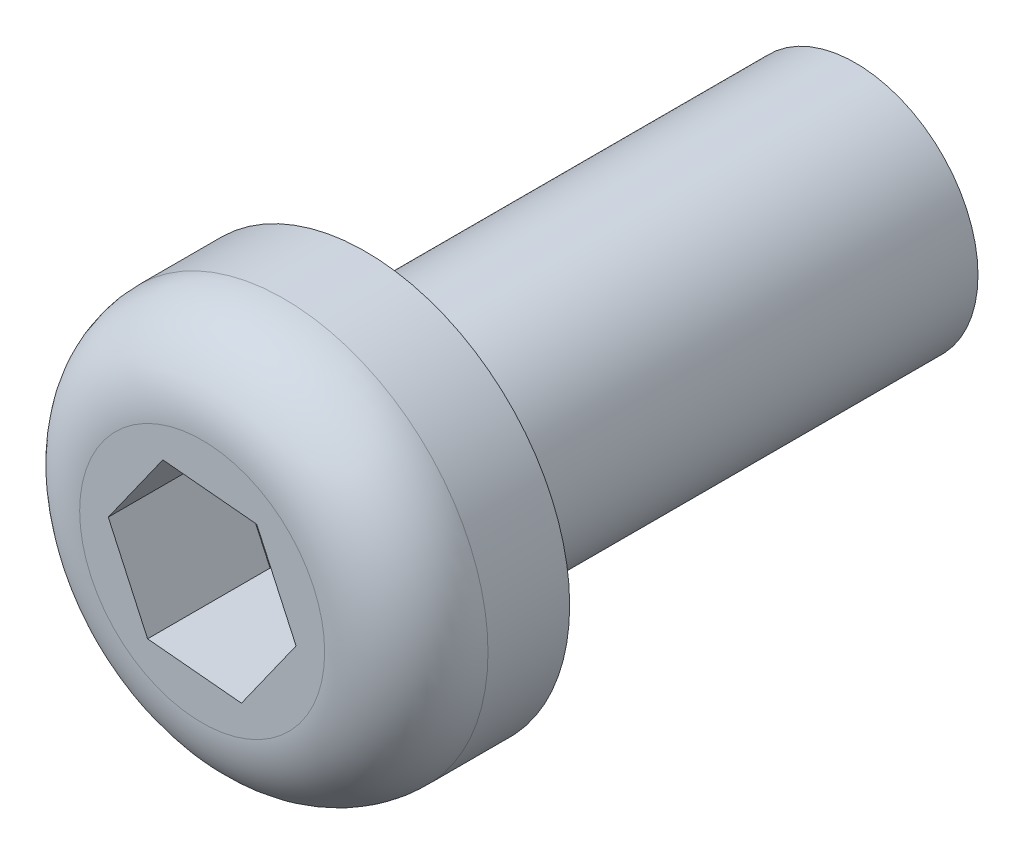
ISO-10303-21;
HEADER;
FILE_DESCRIPTION(('STEP AP214'),'2;1');
FILE_NAME('part.step','',(''),(''),'','','');
FILE_SCHEMA(('AUTOMOTIVE_DESIGN { 1 0 10303 214 1 1 1 1 }'));
ENDSEC;
DATA;
#1=APPLICATION_CONTEXT('core data for automotive mechanical design processes');
#2=APPLICATION_PROTOCOL_DEFINITION('international standard','automotive_design',2000,#1);
#3=PRODUCT_CONTEXT('',#1,'mechanical');
#4=PRODUCT('Part','Part','',(#3));
#5=PRODUCT_RELATED_PRODUCT_CATEGORY('part','',(#4));
#6=PRODUCT_DEFINITION_FORMATION('','',#4);
#7=PRODUCT_DEFINITION_CONTEXT('part definition',#1,'design');
#8=PRODUCT_DEFINITION('design','',#6,#7);
#9=PRODUCT_DEFINITION_SHAPE('','',#8);
#10=(LENGTH_UNIT() NAMED_UNIT(*) SI_UNIT(.MILLI.,.METRE.));
#11=(NAMED_UNIT(*) PLANE_ANGLE_UNIT() SI_UNIT($,.RADIAN.));
#12=(NAMED_UNIT(*) SI_UNIT($,.STERADIAN.) SOLID_ANGLE_UNIT());
#13=UNCERTAINTY_MEASURE_WITH_UNIT(LENGTH_MEASURE(1.E-05),#10,'distance_accuracy_value','');
#14=(GEOMETRIC_REPRESENTATION_CONTEXT(3) GLOBAL_UNCERTAINTY_ASSIGNED_CONTEXT((#13)) GLOBAL_UNIT_ASSIGNED_CONTEXT((#10,
#11,#12)) REPRESENTATION_CONTEXT('',''));
#15=CARTESIAN_POINT('',(0.,0.,0.));
#16=DIRECTION('',(0.,0.,1.));
#17=DIRECTION('',(1.,0.,0.));
#18=AXIS2_PLACEMENT_3D('',#15,#16,#17);
#19=CARTESIAN_POINT('',(0.,0.,6.));
#20=DIRECTION('',(0.,0.,-1.));
#21=DIRECTION('',(-1.,0.,0.));
#22=AXIS2_PLACEMENT_3D('',#19,#20,#21);
#23=CYLINDRICAL_SURFACE('',#22,1.5);
#24=CARTESIAN_POINT('',(0.,0.,6.));
#25=DIRECTION('',(0.,0.,1.));
#26=DIRECTION('',(1.,0.,0.));
#27=AXIS2_PLACEMENT_3D('',#24,#25,#26);
#28=CIRCLE('',#27,1.5);
#29=CARTESIAN_POINT('',(1.5,0.,6.));
#30=VERTEX_POINT('',#29);
#31=EDGE_CURVE('E168',#30,#30,#28,.T.);
#32=ORIENTED_EDGE('',*,*,#31,.F.);
#33=EDGE_LOOP('',(#32));
#34=FACE_BOUND('',#33,.T.);
#35=CARTESIAN_POINT('',(0.,0.,0.));
#36=DIRECTION('',(0.,0.,1.));
#37=DIRECTION('',(1.,0.,0.));
#38=AXIS2_PLACEMENT_3D('',#35,#36,#37);
#39=CIRCLE('',#38,1.5);
#40=CARTESIAN_POINT('',(1.5,0.,0.));
#41=VERTEX_POINT('',#40);
#42=EDGE_CURVE('E167',#41,#41,#39,.T.);
#43=ORIENTED_EDGE('',*,*,#42,.T.);
#44=EDGE_LOOP('',(#43));
#45=FACE_BOUND('',#44,.T.);
#46=ADVANCED_FACE('F39',(#34,#45),#23,.T.);
#47=CARTESIAN_POINT('',(0.,0.,0.));
#48=DIRECTION('',(0.,0.,1.));
#49=DIRECTION('',(1.,0.,0.));
#50=AXIS2_PLACEMENT_3D('',#47,#48,#49);
#51=PLANE('',#50);
#52=ORIENTED_EDGE('',*,*,#42,.F.);
#53=EDGE_LOOP('',(#52));
#54=FACE_BOUND('',#53,.T.);
#55=ADVANCED_FACE('F190',(#54),#51,.F.);
#56=CARTESIAN_POINT('',(0.,0.,8.));
#57=DIRECTION('',(0.,0.,-1.));
#58=DIRECTION('',(-1.,0.,0.));
#59=AXIS2_PLACEMENT_3D('',#56,#57,#58);
#60=CYLINDRICAL_SURFACE('',#59,2.5);
#61=CARTESIAN_POINT('',(0.,0.,7.));
#62=DIRECTION('',(0.,0.,1.));
#63=DIRECTION('',(1.,0.,0.));
#64=AXIS2_PLACEMENT_3D('',#61,#62,#63);
#65=CIRCLE('',#64,2.5);
#66=CARTESIAN_POINT('',(2.5,0.,7.));
#67=VERTEX_POINT('',#66);
#68=EDGE_CURVE('E11',#67,#67,#65,.F.);
#69=ORIENTED_EDGE('',*,*,#68,.T.);
#70=EDGE_LOOP('',(#69));
#71=FACE_BOUND('',#70,.T.);
#72=CARTESIAN_POINT('',(0.,0.,6.));
#73=DIRECTION('',(0.,0.,1.));
#74=DIRECTION('',(1.,0.,0.));
#75=AXIS2_PLACEMENT_3D('',#72,#73,#74);
#76=CIRCLE('',#75,2.5);
#77=CARTESIAN_POINT('',(2.5,0.,6.));
#78=VERTEX_POINT('',#77);
#79=EDGE_CURVE('E154',#78,#78,#76,.T.);
#80=ORIENTED_EDGE('',*,*,#79,.T.);
#81=EDGE_LOOP('',(#80));
#82=FACE_BOUND('',#81,.T.);
#83=ADVANCED_FACE('F195',(#71,#82),#60,.T.);
#84=CARTESIAN_POINT('',(0.,0.,8.));
#85=DIRECTION('',(0.,0.,1.));
#86=DIRECTION('',(1.,0.,0.));
#87=AXIS2_PLACEMENT_3D('',#84,#85,#86);
#88=PLANE('',#87);
#89=CARTESIAN_POINT('',(0.,0.,8.));
#90=DIRECTION('',(0.,0.,1.));
#91=DIRECTION('',(1.,0.,0.));
#92=AXIS2_PLACEMENT_3D('',#89,#90,#91);
#93=CIRCLE('',#92,1.5);
#94=CARTESIAN_POINT('',(1.5,0.,8.));
#95=VERTEX_POINT('',#94);
#96=EDGE_CURVE('E48',#95,#95,#93,.T.);
#97=ORIENTED_EDGE('',*,*,#96,.T.);
#98=EDGE_LOOP('',(#97));
#99=FACE_BOUND('',#98,.T.);
#100=DIRECTION('',(0.57878591184661,0.815479532697104,0.));
#101=VECTOR('',#100,1.);
#102=CARTESIAN_POINT('',(0.4813173306893,-1.04960323956791,8.));
#103=LINE('',#102,#101);
#104=CARTESIAN_POINT('',(0.4813173306893,-1.04960323956791,8.));
#105=VERTEX_POINT('',#104);
#106=CARTESIAN_POINT('',(1.14964173470491,-0.107968584125307,8.));
#107=VERTEX_POINT('',#106);
#108=EDGE_CURVE('E55',#105,#107,#103,.T.);
#109=ORIENTED_EDGE('',*,*,#108,.F.);
#110=DIRECTION('',(0.99561894750526,-0.093503536663153,0.));
#111=VECTOR('',#110,1.);
#112=CARTESIAN_POINT('',(-0.668324404015607,-0.941634655442607,8.));
#113=LINE('',#112,#111);
#114=CARTESIAN_POINT('',(-0.668324404015607,-0.941634655442607,8.));
#115=VERTEX_POINT('',#114);
#116=EDGE_CURVE('E148',#115,#105,#113,.T.);
#117=ORIENTED_EDGE('',*,*,#116,.F.);
#118=DIRECTION('',(0.41683303565865,-0.908983069360257,0.));
#119=VECTOR('',#118,1.);
#120=CARTESIAN_POINT('',(-1.14964173470491,0.107968584125307,8.));
#121=LINE('',#120,#119);
#122=CARTESIAN_POINT('',(-1.14964173470491,0.107968584125307,8.));
#123=VERTEX_POINT('',#122);
#124=EDGE_CURVE('E145',#123,#115,#121,.T.);
#125=ORIENTED_EDGE('',*,*,#124,.F.);
#126=DIRECTION('',(-0.57878591184661,-0.815479532697105,0.));
#127=VECTOR('',#126,1.);
#128=CARTESIAN_POINT('',(-0.481317330689301,1.04960323956791,8.));
#129=LINE('',#128,#127);
#130=CARTESIAN_POINT('',(-0.481317330689301,1.04960323956791,8.));
#131=VERTEX_POINT('',#130);
#132=EDGE_CURVE('E103',#131,#123,#129,.T.);
#133=ORIENTED_EDGE('',*,*,#132,.F.);
#134=DIRECTION('',(-0.99561894750526,0.093503536663153,0.));
#135=VECTOR('',#134,1.);
#136=CARTESIAN_POINT('',(0.668324404015606,0.941634655442607,8.));
#137=LINE('',#136,#135);
#138=CARTESIAN_POINT('',(0.668324404015606,0.941634655442607,8.));
#139=VERTEX_POINT('',#138);
#140=EDGE_CURVE('E139',#139,#131,#137,.T.);
#141=ORIENTED_EDGE('',*,*,#140,.F.);
#142=DIRECTION('',(-0.41683303565865,0.908983069360257,0.));
#143=VECTOR('',#142,1.);
#144=CARTESIAN_POINT('',(1.14964173470491,-0.107968584125307,8.));
#145=LINE('',#144,#143);
#146=EDGE_CURVE('E135',#107,#139,#145,.T.);
#147=ORIENTED_EDGE('',*,*,#146,.F.);
#148=EDGE_LOOP('',(#109,#117,#125,#133,#141,#147));
#149=FACE_BOUND('',#148,.T.);
#150=ADVANCED_FACE('F178',(#99,#149),#88,.T.);
#151=CARTESIAN_POINT('',(0.,0.,6.));
#152=DIRECTION('',(0.,0.,1.));
#153=DIRECTION('',(1.,0.,0.));
#154=AXIS2_PLACEMENT_3D('',#151,#152,#153);
#155=PLANE('',#154);
#156=ORIENTED_EDGE('',*,*,#31,.T.);
#157=EDGE_LOOP('',(#156));
#158=FACE_BOUND('',#157,.T.);
#159=ORIENTED_EDGE('',*,*,#79,.F.);
#160=EDGE_LOOP('',(#159));
#161=FACE_BOUND('',#160,.T.);
#162=ADVANCED_FACE('F204',(#158,#161),#155,.F.);
#163=CARTESIAN_POINT('',(0.4813173306893,-1.04960323956791,6.5));
#164=DIRECTION('',(0.815479532697104,-0.57878591184661,0.));
#165=DIRECTION('',(0.57878591184661,0.815479532697104,0.));
#166=AXIS2_PLACEMENT_3D('',#163,#164,#165);
#167=PLANE('',#166);
#168=ORIENTED_EDGE('',*,*,#108,.T.);
#169=DIRECTION('',(0.,0.,1.));
#170=VECTOR('',#169,1.);
#171=CARTESIAN_POINT('',(1.14964173470491,-0.107968584125307,6.5));
#172=LINE('',#171,#170);
#173=CARTESIAN_POINT('',(1.14964173470491,-0.107968584125307,6.5));
#174=VERTEX_POINT('',#173);
#175=EDGE_CURVE('E85',#174,#107,#172,.T.);
#176=ORIENTED_EDGE('',*,*,#175,.F.);
#177=DIRECTION('',(0.57878591184661,0.815479532697104,0.));
#178=VECTOR('',#177,1.);
#179=CARTESIAN_POINT('',(0.4813173306893,-1.04960323956791,6.5));
#180=LINE('',#179,#178);
#181=CARTESIAN_POINT('',(0.4813173306893,-1.04960323956791,6.5));
#182=VERTEX_POINT('',#181);
#183=EDGE_CURVE('E151',#182,#174,#180,.T.);
#184=ORIENTED_EDGE('',*,*,#183,.F.);
#185=DIRECTION('',(0.,0.,1.));
#186=VECTOR('',#185,1.);
#187=CARTESIAN_POINT('',(0.4813173306893,-1.04960323956791,6.5));
#188=LINE('',#187,#186);
#189=EDGE_CURVE('E63',#182,#105,#188,.T.);
#190=ORIENTED_EDGE('',*,*,#189,.T.);
#191=EDGE_LOOP('',(#168,#176,#184,#190));
#192=FACE_BOUND('',#191,.T.);
#193=ADVANCED_FACE('F207',(#192),#167,.F.);
#194=CARTESIAN_POINT('',(-0.668324404015607,-0.941634655442607,6.5));
#195=DIRECTION('',(-0.093503536663153,-0.99561894750526,0.));
#196=DIRECTION('',(0.99561894750526,-0.093503536663153,0.));
#197=AXIS2_PLACEMENT_3D('',#194,#195,#196);
#198=PLANE('',#197);
#199=ORIENTED_EDGE('',*,*,#116,.T.);
#200=ORIENTED_EDGE('',*,*,#189,.F.);
#201=DIRECTION('',(0.99561894750526,-0.093503536663153,0.));
#202=VECTOR('',#201,1.);
#203=CARTESIAN_POINT('',(-0.668324404015607,-0.941634655442607,6.5));
#204=LINE('',#203,#202);
#205=CARTESIAN_POINT('',(-0.668324404015607,-0.941634655442607,6.5));
#206=VERTEX_POINT('',#205);
#207=EDGE_CURVE('E117',#206,#182,#204,.T.);
#208=ORIENTED_EDGE('',*,*,#207,.F.);
#209=DIRECTION('',(0.,0.,1.));
#210=VECTOR('',#209,1.);
#211=CARTESIAN_POINT('',(-0.668324404015607,-0.941634655442607,6.5));
#212=LINE('',#211,#210);
#213=EDGE_CURVE('E108',#206,#115,#212,.T.);
#214=ORIENTED_EDGE('',*,*,#213,.T.);
#215=EDGE_LOOP('',(#199,#200,#208,#214));
#216=FACE_BOUND('',#215,.T.);
#217=ADVANCED_FACE('F213',(#216),#198,.F.);
#218=CARTESIAN_POINT('',(-1.14964173470491,0.107968584125307,6.5));
#219=DIRECTION('',(-0.908983069360257,-0.41683303565865,0.));
#220=DIRECTION('',(0.41683303565865,-0.908983069360258,0.));
#221=AXIS2_PLACEMENT_3D('',#218,#219,#220);
#222=PLANE('',#221);
#223=ORIENTED_EDGE('',*,*,#124,.T.);
#224=ORIENTED_EDGE('',*,*,#213,.F.);
#225=DIRECTION('',(0.41683303565865,-0.908983069360257,0.));
#226=VECTOR('',#225,1.);
#227=CARTESIAN_POINT('',(-1.14964173470491,0.107968584125307,6.5));
#228=LINE('',#227,#226);
#229=CARTESIAN_POINT('',(-1.14964173470491,0.107968584125307,6.5));
#230=VERTEX_POINT('',#229);
#231=EDGE_CURVE('E112',#230,#206,#228,.T.);
#232=ORIENTED_EDGE('',*,*,#231,.F.);
#233=DIRECTION('',(0.,0.,1.));
#234=VECTOR('',#233,1.);
#235=CARTESIAN_POINT('',(-1.14964173470491,0.107968584125307,6.5));
#236=LINE('',#235,#234);
#237=EDGE_CURVE('E96',#230,#123,#236,.T.);
#238=ORIENTED_EDGE('',*,*,#237,.T.);
#239=EDGE_LOOP('',(#223,#224,#232,#238));
#240=FACE_BOUND('',#239,.T.);
#241=ADVANCED_FACE('F113',(#240),#222,.F.);
#242=CARTESIAN_POINT('',(-0.481317330689301,1.04960323956791,6.5));
#243=DIRECTION('',(-0.815479532697105,0.57878591184661,0.));
#244=DIRECTION('',(-0.57878591184661,-0.815479532697105,0.));
#245=AXIS2_PLACEMENT_3D('',#242,#243,#244);
#246=PLANE('',#245);
#247=ORIENTED_EDGE('',*,*,#132,.T.);
#248=ORIENTED_EDGE('',*,*,#237,.F.);
#249=DIRECTION('',(-0.57878591184661,-0.815479532697105,0.));
#250=VECTOR('',#249,1.);
#251=CARTESIAN_POINT('',(-0.481317330689301,1.04960323956791,6.5));
#252=LINE('',#251,#250);
#253=CARTESIAN_POINT('',(-0.481317330689301,1.04960323956791,6.5));
#254=VERTEX_POINT('',#253);
#255=EDGE_CURVE('E100',#254,#230,#252,.T.);
#256=ORIENTED_EDGE('',*,*,#255,.F.);
#257=DIRECTION('',(0.,0.,1.));
#258=VECTOR('',#257,1.);
#259=CARTESIAN_POINT('',(-0.481317330689301,1.04960323956791,6.5));
#260=LINE('',#259,#258);
#261=EDGE_CURVE('E109',#254,#131,#260,.T.);
#262=ORIENTED_EDGE('',*,*,#261,.T.);
#263=EDGE_LOOP('',(#247,#248,#256,#262));
#264=FACE_BOUND('',#263,.T.);
#265=ADVANCED_FACE('F98',(#264),#246,.F.);
#266=CARTESIAN_POINT('',(0.668324404015606,0.941634655442607,6.5));
#267=DIRECTION('',(0.093503536663153,0.99561894750526,0.));
#268=DIRECTION('',(-0.99561894750526,0.093503536663153,0.));
#269=AXIS2_PLACEMENT_3D('',#266,#267,#268);
#270=PLANE('',#269);
#271=ORIENTED_EDGE('',*,*,#140,.T.);
#272=ORIENTED_EDGE('',*,*,#261,.F.);
#273=DIRECTION('',(-0.99561894750526,0.093503536663153,0.));
#274=VECTOR('',#273,1.);
#275=CARTESIAN_POINT('',(0.668324404015606,0.941634655442607,6.5));
#276=LINE('',#275,#274);
#277=CARTESIAN_POINT('',(0.668324404015606,0.941634655442607,6.5));
#278=VERTEX_POINT('',#277);
#279=EDGE_CURVE('E123',#278,#254,#276,.T.);
#280=ORIENTED_EDGE('',*,*,#279,.F.);
#281=DIRECTION('',(0.,0.,1.));
#282=VECTOR('',#281,1.);
#283=CARTESIAN_POINT('',(0.668324404015606,0.941634655442607,6.5));
#284=LINE('',#283,#282);
#285=EDGE_CURVE('E159',#278,#139,#284,.T.);
#286=ORIENTED_EDGE('',*,*,#285,.T.);
#287=EDGE_LOOP('',(#271,#272,#280,#286));
#288=FACE_BOUND('',#287,.T.);
#289=ADVANCED_FACE('F216',(#288),#270,.F.);
#290=CARTESIAN_POINT('',(1.14964173470491,-0.107968584125307,6.5));
#291=DIRECTION('',(0.908983069360257,0.41683303565865,0.));
#292=DIRECTION('',(-0.41683303565865,0.908983069360257,0.));
#293=AXIS2_PLACEMENT_3D('',#290,#291,#292);
#294=PLANE('',#293);
#295=ORIENTED_EDGE('',*,*,#146,.T.);
#296=ORIENTED_EDGE('',*,*,#285,.F.);
#297=DIRECTION('',(-0.41683303565865,0.908983069360257,0.));
#298=VECTOR('',#297,1.);
#299=CARTESIAN_POINT('',(1.14964173470491,-0.107968584125307,6.5));
#300=LINE('',#299,#298);
#301=EDGE_CURVE('E127',#174,#278,#300,.T.);
#302=ORIENTED_EDGE('',*,*,#301,.F.);
#303=ORIENTED_EDGE('',*,*,#175,.T.);
#304=EDGE_LOOP('',(#295,#296,#302,#303));
#305=FACE_BOUND('',#304,.T.);
#306=ADVANCED_FACE('F186',(#305),#294,.F.);
#307=CARTESIAN_POINT('',(0.,0.,6.5));
#308=DIRECTION('',(0.,0.,1.));
#309=DIRECTION('',(1.,0.,0.));
#310=AXIS2_PLACEMENT_3D('',#307,#308,#309);
#311=PLANE('',#310);
#312=ORIENTED_EDGE('',*,*,#183,.T.);
#313=ORIENTED_EDGE('',*,*,#301,.T.);
#314=ORIENTED_EDGE('',*,*,#279,.T.);
#315=ORIENTED_EDGE('',*,*,#255,.T.);
#316=ORIENTED_EDGE('',*,*,#231,.T.);
#317=ORIENTED_EDGE('',*,*,#207,.T.);
#318=EDGE_LOOP('',(#312,#313,#314,#315,#316,#317));
#319=FACE_BOUND('',#318,.T.);
#320=ADVANCED_FACE('F120',(#319),#311,.T.);
#321=CARTESIAN_POINT('',(0.,0.,7.));
#322=DIRECTION('',(0.,0.,1.));
#323=DIRECTION('',(1.,0.,0.));
#324=AXIS2_PLACEMENT_3D('',#321,#322,#323);
#325=TOROIDAL_SURFACE('',#324,1.5,1.);
#326=ORIENTED_EDGE('',*,*,#68,.F.);
#327=EDGE_LOOP('',(#326));
#328=FACE_BOUND('',#327,.T.);
#329=ORIENTED_EDGE('',*,*,#96,.F.);
#330=EDGE_LOOP('',(#329));
#331=FACE_BOUND('',#330,.T.);
#332=ADVANCED_FACE('F41',(#328,#331),#325,.T.);
#333=CLOSED_SHELL('',(#46,#55,#83,#150,#162,#193,#217,#241,#265,#289,#306,#320,#332));
#334=MANIFOLD_SOLID_BREP('B2',#333);
#335=ADVANCED_BREP_SHAPE_REPRESENTATION('',(#18,#334),#14);
#336=SHAPE_DEFINITION_REPRESENTATION(#9,#335);
ENDSEC;
END-ISO-10303-21;
